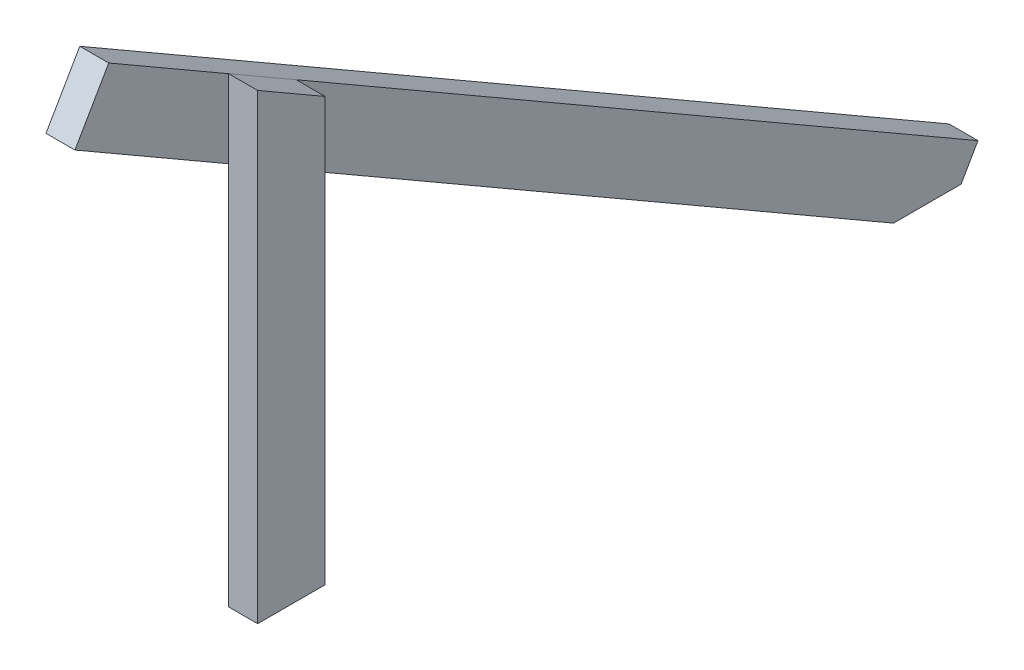
ISO-10303-21;
HEADER;
FILE_DESCRIPTION(('STEP AP214'),'2;1');
FILE_NAME('part.step','',(''),(''),'','','');
FILE_SCHEMA(('AUTOMOTIVE_DESIGN { 1 0 10303 214 1 1 1 1 }'));
ENDSEC;
DATA;
#1=APPLICATION_CONTEXT('core data for automotive mechanical design processes');
#2=APPLICATION_PROTOCOL_DEFINITION('international standard','automotive_design',2000,#1);
#3=PRODUCT_CONTEXT('',#1,'mechanical');
#4=PRODUCT('Part','Part','',(#3));
#5=PRODUCT_RELATED_PRODUCT_CATEGORY('part','',(#4));
#6=PRODUCT_DEFINITION_FORMATION('','',#4);
#7=PRODUCT_DEFINITION_CONTEXT('part definition',#1,'design');
#8=PRODUCT_DEFINITION('design','',#6,#7);
#9=PRODUCT_DEFINITION_SHAPE('','',#8);
#10=(LENGTH_UNIT() NAMED_UNIT(*) SI_UNIT(.MILLI.,.METRE.));
#11=(NAMED_UNIT(*) PLANE_ANGLE_UNIT() SI_UNIT($,.RADIAN.));
#12=(NAMED_UNIT(*) SI_UNIT($,.STERADIAN.) SOLID_ANGLE_UNIT());
#13=UNCERTAINTY_MEASURE_WITH_UNIT(LENGTH_MEASURE(1.E-05),#10,'distance_accuracy_value','');
#14=(GEOMETRIC_REPRESENTATION_CONTEXT(3) GLOBAL_UNCERTAINTY_ASSIGNED_CONTEXT((#13)) GLOBAL_UNIT_ASSIGNED_CONTEXT((#10,
#11,#12)) REPRESENTATION_CONTEXT('',''));
#15=CARTESIAN_POINT('',(0.,0.,0.));
#16=DIRECTION('',(0.,0.,1.));
#17=DIRECTION('',(1.,0.,0.));
#18=AXIS2_PLACEMENT_3D('',#15,#16,#17);
#19=CARTESIAN_POINT('',(57.1500000000016,2.22044604925031E-13,963.751224977093));
#20=DIRECTION('',(-1.,0.,0.));
#21=DIRECTION('',(0.,-1.,0.));
#22=AXIS2_PLACEMENT_3D('',#19,#20,#21);
#23=PLANE('',#22);
#24=DIRECTION('',(0.,-0.500000000000001,-0.866025403784438));
#25=VECTOR('',#24,1.);
#26=CARTESIAN_POINT('',(57.1500000000006,455.811351077486,700.588418732819));
#27=LINE('',#26,#25);
#28=CARTESIAN_POINT('',(57.1499999999997,607.748468103316,963.751224977093));
#29=VERTEX_POINT('',#28);
#30=CARTESIAN_POINT('',(57.15,556.422029172358,874.851224977093));
#31=VERTEX_POINT('',#30);
#32=EDGE_CURVE('E151',#29,#31,#27,.T.);
#33=ORIENTED_EDGE('',*,*,#32,.F.);
#34=DIRECTION('',(0.,1.,0.));
#35=VECTOR('',#34,1.);
#36=CARTESIAN_POINT('',(57.1500000000016,2.22044604925031E-13,963.751224977093));
#37=LINE('',#36,#35);
#38=CARTESIAN_POINT('',(57.1500000000016,2.22044604925031E-13,963.751224977093));
#39=VERTEX_POINT('',#38);
#40=EDGE_CURVE('E152',#39,#29,#37,.T.);
#41=ORIENTED_EDGE('',*,*,#40,.F.);
#42=DIRECTION('',(0.,0.,1.));
#43=VECTOR('',#42,1.);
#44=CARTESIAN_POINT('',(57.1500000000016,2.22044604925031E-13,963.751224977093));
#45=LINE('',#44,#43);
#46=CARTESIAN_POINT('',(57.1500000000017,3.33066907387547E-13,874.851224977093));
#47=VERTEX_POINT('',#46);
#48=EDGE_CURVE('E167',#47,#39,#45,.T.);
#49=ORIENTED_EDGE('',*,*,#48,.F.);
#50=DIRECTION('',(0.,1.,0.));
#51=VECTOR('',#50,1.);
#52=CARTESIAN_POINT('',(57.1500000000017,3.33066907387547E-13,874.851224977093));
#53=LINE('',#52,#51);
#54=EDGE_CURVE('E106',#47,#31,#53,.T.);
#55=ORIENTED_EDGE('',*,*,#54,.T.);
#56=EDGE_LOOP('',(#33,#41,#49,#55));
#57=FACE_BOUND('',#56,.T.);
#58=ADVANCED_FACE('F102',(#57),#23,.F.);
#59=CARTESIAN_POINT('',(19.0500000000016,1.11022302462516E-13,963.751224977093));
#60=DIRECTION('',(0.,0.,-1.));
#61=DIRECTION('',(0.,1.,0.));
#62=AXIS2_PLACEMENT_3D('',#59,#60,#61);
#63=PLANE('',#62);
#64=DIRECTION('',(1.,0.,0.));
#65=VECTOR('',#64,1.);
#66=CARTESIAN_POINT('',(19.0499999999992,607.748468103316,963.751224977093));
#67=LINE('',#66,#65);
#68=CARTESIAN_POINT('',(19.0499999999997,607.748468103315,963.751224977093));
#69=VERTEX_POINT('',#68);
#70=EDGE_CURVE('E140',#69,#29,#67,.T.);
#71=ORIENTED_EDGE('',*,*,#70,.F.);
#72=DIRECTION('',(0.,1.,0.));
#73=VECTOR('',#72,1.);
#74=CARTESIAN_POINT('',(19.0500000000016,1.11022302462516E-13,963.751224977093));
#75=LINE('',#74,#73);
#76=CARTESIAN_POINT('',(19.0500000000016,1.11022302462516E-13,963.751224977093));
#77=VERTEX_POINT('',#76);
#78=EDGE_CURVE('E157',#77,#69,#75,.T.);
#79=ORIENTED_EDGE('',*,*,#78,.F.);
#80=DIRECTION('',(-1.,0.,0.));
#81=VECTOR('',#80,1.);
#82=CARTESIAN_POINT('',(19.0500000000016,1.11022302462516E-13,963.751224977093));
#83=LINE('',#82,#81);
#84=EDGE_CURVE('E135',#39,#77,#83,.T.);
#85=ORIENTED_EDGE('',*,*,#84,.F.);
#86=ORIENTED_EDGE('',*,*,#40,.T.);
#87=EDGE_LOOP('',(#71,#79,#85,#86));
#88=FACE_BOUND('',#87,.T.);
#89=ADVANCED_FACE('F156',(#88),#63,.F.);
#90=CARTESIAN_POINT('',(19.0500000000016,1.11022302462516E-13,963.751224977093));
#91=DIRECTION('',(1.,0.,0.));
#92=DIRECTION('',(0.,1.,0.));
#93=AXIS2_PLACEMENT_3D('',#90,#91,#92);
#94=PLANE('',#93);
#95=DIRECTION('',(0.,0.500000000000001,0.866025403784438));
#96=VECTOR('',#95,1.);
#97=CARTESIAN_POINT('',(19.0500000000006,455.811351077486,700.588418732819));
#98=LINE('',#97,#96);
#99=CARTESIAN_POINT('',(19.0499999999917,556.422029172358,874.851224977093));
#100=VERTEX_POINT('',#99);
#101=EDGE_CURVE('E13',#100,#69,#98,.T.);
#102=ORIENTED_EDGE('',*,*,#101,.F.);
#103=DIRECTION('',(0.,1.,0.));
#104=VECTOR('',#103,1.);
#105=CARTESIAN_POINT('',(19.0500000000017,2.22044604925031E-13,874.851224977093));
#106=LINE('',#105,#104);
#107=CARTESIAN_POINT('',(19.0500000000017,2.22044604925031E-13,874.851224977093));
#108=VERTEX_POINT('',#107);
#109=EDGE_CURVE('E166',#108,#100,#106,.T.);
#110=ORIENTED_EDGE('',*,*,#109,.F.);
#111=DIRECTION('',(0.,0.,-1.));
#112=VECTOR('',#111,1.);
#113=CARTESIAN_POINT('',(19.0500000000016,1.11022302462516E-13,963.751224977093));
#114=LINE('',#113,#112);
#115=EDGE_CURVE('E161',#77,#108,#114,.T.);
#116=ORIENTED_EDGE('',*,*,#115,.F.);
#117=ORIENTED_EDGE('',*,*,#78,.T.);
#118=EDGE_LOOP('',(#102,#110,#116,#117));
#119=FACE_BOUND('',#118,.T.);
#120=ADVANCED_FACE('F175',(#119),#94,.F.);
#121=CARTESIAN_POINT('',(19.0500000000017,2.22044604925031E-13,874.851224977093));
#122=DIRECTION('',(0.,0.,1.));
#123=DIRECTION('',(0.,-1.,0.));
#124=AXIS2_PLACEMENT_3D('',#121,#122,#123);
#125=PLANE('',#124);
#126=DIRECTION('',(-1.,0.,0.));
#127=VECTOR('',#126,1.);
#128=CARTESIAN_POINT('',(19.0499999999995,556.422029172358,874.851224977093));
#129=LINE('',#128,#127);
#130=EDGE_CURVE('E112',#31,#100,#129,.T.);
#131=ORIENTED_EDGE('',*,*,#130,.F.);
#132=ORIENTED_EDGE('',*,*,#54,.F.);
#133=DIRECTION('',(1.,0.,0.));
#134=VECTOR('',#133,1.);
#135=CARTESIAN_POINT('',(19.0500000000017,2.22044604925031E-13,874.851224977093));
#136=LINE('',#135,#134);
#137=EDGE_CURVE('E121',#108,#47,#136,.T.);
#138=ORIENTED_EDGE('',*,*,#137,.F.);
#139=ORIENTED_EDGE('',*,*,#109,.T.);
#140=EDGE_LOOP('',(#131,#132,#138,#139));
#141=FACE_BOUND('',#140,.T.);
#142=ADVANCED_FACE('F176',(#141),#125,.F.);
#143=CARTESIAN_POINT('',(19.0500000000001,1.33226762955019E-12,5.5181307555685E-13));
#144=DIRECTION('',(0.,-1.,0.));
#145=DIRECTION('',(1.,0.,0.));
#146=AXIS2_PLACEMENT_3D('',#143,#144,#145);
#147=PLANE('',#146);
#148=ORIENTED_EDGE('',*,*,#48,.T.);
#149=ORIENTED_EDGE('',*,*,#84,.T.);
#150=ORIENTED_EDGE('',*,*,#115,.T.);
#151=ORIENTED_EDGE('',*,*,#137,.T.);
#152=EDGE_LOOP('',(#148,#149,#150,#151));
#153=FACE_BOUND('',#152,.T.);
#154=ADVANCED_FACE('F173',(#153),#147,.T.);
#155=CARTESIAN_POINT('',(-19.0500000000002,698.894829198219,1121.62135331849));
#156=DIRECTION('',(0.,0.866025403784438,-0.500000000000001));
#157=DIRECTION('',(0.,0.500000000000001,0.866025403784438));
#158=AXIS2_PLACEMENT_3D('',#155,#156,#157);
#159=PLANE('',#158);
#160=ORIENTED_EDGE('',*,*,#70,.T.);
#161=ORIENTED_EDGE('',*,*,#32,.T.);
#162=ORIENTED_EDGE('',*,*,#130,.T.);
#163=ORIENTED_EDGE('',*,*,#101,.T.);
#164=EDGE_LOOP('',(#160,#161,#162,#163));
#165=FACE_BOUND('',#164,.T.);
#166=ADVANCED_FACE('F104',(#165),#159,.T.);
#167=CLOSED_SHELL('',(#58,#89,#120,#142,#154,#166));
#168=MANIFOLD_SOLID_BREP('B2',#167);
#169=CARTESIAN_POINT('',(19.0499999999998,698.89482919822,1121.62135331849));
#170=DIRECTION('',(-1.,0.,0.));
#171=DIRECTION('',(0.,-1.,0.));
#172=AXIS2_PLACEMENT_3D('',#169,#170,#171);
#173=PLANE('',#172);
#174=DIRECTION('',(0.,-0.500000000000001,-0.866025403784438));
#175=VECTOR('',#174,1.);
#176=CARTESIAN_POINT('',(19.0500000000002,621.905170801783,1166.07135331849));
#177=LINE('',#176,#175);
#178=CARTESIAN_POINT('',(19.0500000000002,621.905170801783,1166.07135331849));
#179=VERTEX_POINT('',#178);
#180=CARTESIAN_POINT('',(19.0500000000002,1.11022302462513E-13,88.8999999999997));
#181=VERTEX_POINT('',#180);
#182=EDGE_CURVE('E328',#179,#181,#177,.T.);
#183=ORIENTED_EDGE('',*,*,#182,.T.);
#184=DIRECTION('',(0.,0.,-1.));
#185=VECTOR('',#184,1.);
#186=CARTESIAN_POINT('',(19.050000000002,1.11022302462516E-13,1121.62135331849));
#187=LINE('',#186,#185);
#188=CARTESIAN_POINT('',(19.0500000000002,0.,0.));
#189=VERTEX_POINT('',#188);
#190=EDGE_CURVE('E317',#181,#189,#187,.T.);
#191=ORIENTED_EDGE('',*,*,#190,.T.);
#192=DIRECTION('',(0.,0.866025403784438,-0.500000000000001));
#193=VECTOR('',#192,1.);
#194=CARTESIAN_POINT('',(19.0499999999998,38.4948291982183,-22.2250000000001));
#195=LINE('',#194,#193);
#196=CARTESIAN_POINT('',(19.0499999999998,38.4948291982183,-22.2250000000001));
#197=VERTEX_POINT('',#196);
#198=EDGE_CURVE('E326',#189,#197,#195,.T.);
#199=ORIENTED_EDGE('',*,*,#198,.T.);
#200=DIRECTION('',(0.,-0.500000000000001,-0.866025403784438));
#201=VECTOR('',#200,1.);
#202=CARTESIAN_POINT('',(19.0499999999998,698.89482919822,1121.62135331849));
#203=LINE('',#202,#201);
#204=CARTESIAN_POINT('',(19.0499999999998,698.89482919822,1121.62135331849));
#205=VERTEX_POINT('',#204);
#206=EDGE_CURVE('E272',#205,#197,#203,.T.);
#207=ORIENTED_EDGE('',*,*,#206,.F.);
#208=DIRECTION('',(0.,0.866025403784438,-0.500000000000001));
#209=VECTOR('',#208,1.);
#210=CARTESIAN_POINT('',(19.0499999999998,698.89482919822,1121.62135331849));
#211=LINE('',#210,#209);
#212=EDGE_CURVE('E340',#179,#205,#211,.T.);
#213=ORIENTED_EDGE('',*,*,#212,.F.);
#214=EDGE_LOOP('',(#183,#191,#199,#207,#213));
#215=FACE_BOUND('',#214,.T.);
#216=ADVANCED_FACE('F265',(#215),#173,.F.);
#217=CARTESIAN_POINT('',(-19.0500000000002,698.894829198219,1121.62135331849));
#218=DIRECTION('',(0.,-0.866025403784438,0.500000000000001));
#219=DIRECTION('',(0.,-0.500000000000001,-0.866025403784438));
#220=AXIS2_PLACEMENT_3D('',#217,#218,#219);
#221=PLANE('',#220);
#222=DIRECTION('',(-1.,0.,0.));
#223=VECTOR('',#222,1.);
#224=CARTESIAN_POINT('',(-19.0500000000002,38.4948291982182,-22.225));
#225=LINE('',#224,#223);
#226=CARTESIAN_POINT('',(-19.0500000000002,38.4948291982182,-22.225));
#227=VERTEX_POINT('',#226);
#228=EDGE_CURVE('E303',#197,#227,#225,.T.);
#229=ORIENTED_EDGE('',*,*,#228,.T.);
#230=DIRECTION('',(0.,-0.500000000000001,-0.866025403784438));
#231=VECTOR('',#230,1.);
#232=CARTESIAN_POINT('',(-19.0500000000002,698.894829198219,1121.62135331849));
#233=LINE('',#232,#231);
#234=CARTESIAN_POINT('',(-19.0500000000002,698.894829198219,1121.62135331849));
#235=VERTEX_POINT('',#234);
#236=EDGE_CURVE('E345',#235,#227,#233,.T.);
#237=ORIENTED_EDGE('',*,*,#236,.F.);
#238=DIRECTION('',(-1.,0.,0.));
#239=VECTOR('',#238,1.);
#240=CARTESIAN_POINT('',(-19.0500000000002,698.894829198219,1121.62135331849));
#241=LINE('',#240,#239);
#242=EDGE_CURVE('E308',#205,#235,#241,.T.);
#243=ORIENTED_EDGE('',*,*,#242,.F.);
#244=ORIENTED_EDGE('',*,*,#206,.T.);
#245=EDGE_LOOP('',(#229,#237,#243,#244));
#246=FACE_BOUND('',#245,.T.);
#247=ADVANCED_FACE('F346',(#246),#221,.F.);
#248=CARTESIAN_POINT('',(-19.0500000000002,698.894829198219,1121.62135331849));
#249=DIRECTION('',(1.,0.,0.));
#250=DIRECTION('',(0.,1.,0.));
#251=AXIS2_PLACEMENT_3D('',#248,#249,#250);
#252=PLANE('',#251);
#253=DIRECTION('',(0.,-0.866025403784438,0.500000000000001));
#254=VECTOR('',#253,1.);
#255=CARTESIAN_POINT('',(-19.0500000000002,38.4948291982182,-22.225));
#256=LINE('',#255,#254);
#257=CARTESIAN_POINT('',(-19.05,0.,0.));
#258=VERTEX_POINT('',#257);
#259=EDGE_CURVE('E333',#227,#258,#256,.T.);
#260=ORIENTED_EDGE('',*,*,#259,.T.);
#261=DIRECTION('',(0.,0.,1.));
#262=VECTOR('',#261,1.);
#263=CARTESIAN_POINT('',(-19.049999999998,0.,1121.62135331849));
#264=LINE('',#263,#262);
#265=CARTESIAN_POINT('',(-19.0499999999998,0.,88.9));
#266=VERTEX_POINT('',#265);
#267=EDGE_CURVE('E279',#258,#266,#264,.T.);
#268=ORIENTED_EDGE('',*,*,#267,.T.);
#269=DIRECTION('',(0.,-0.500000000000001,-0.866025403784438));
#270=VECTOR('',#269,1.);
#271=CARTESIAN_POINT('',(-19.0499999999998,621.905170801783,1166.07135331849));
#272=LINE('',#271,#270);
#273=CARTESIAN_POINT('',(-19.0499999999998,621.905170801783,1166.07135331849));
#274=VERTEX_POINT('',#273);
#275=EDGE_CURVE('E342',#274,#266,#272,.T.);
#276=ORIENTED_EDGE('',*,*,#275,.F.);
#277=DIRECTION('',(0.,-0.866025403784438,0.500000000000001));
#278=VECTOR('',#277,1.);
#279=CARTESIAN_POINT('',(-19.0500000000002,698.894829198219,1121.62135331849));
#280=LINE('',#279,#278);
#281=EDGE_CURVE('E348',#235,#274,#280,.T.);
#282=ORIENTED_EDGE('',*,*,#281,.F.);
#283=ORIENTED_EDGE('',*,*,#236,.T.);
#284=EDGE_LOOP('',(#260,#268,#276,#282,#283));
#285=FACE_BOUND('',#284,.T.);
#286=ADVANCED_FACE('F354',(#285),#252,.F.);
#287=CARTESIAN_POINT('',(-19.0499999999998,621.905170801783,1166.07135331849));
#288=DIRECTION('',(0.,0.866025403784438,-0.500000000000001));
#289=DIRECTION('',(0.,0.500000000000001,0.866025403784438));
#290=AXIS2_PLACEMENT_3D('',#287,#288,#289);
#291=PLANE('',#290);
#292=ORIENTED_EDGE('',*,*,#275,.T.);
#293=DIRECTION('',(1.,0.,0.));
#294=VECTOR('',#293,1.);
#295=CARTESIAN_POINT('',(-19.0499999999995,0.,88.9));
#296=LINE('',#295,#294);
#297=EDGE_CURVE('E329',#266,#181,#296,.T.);
#298=ORIENTED_EDGE('',*,*,#297,.T.);
#299=ORIENTED_EDGE('',*,*,#182,.F.);
#300=DIRECTION('',(1.,0.,0.));
#301=VECTOR('',#300,1.);
#302=CARTESIAN_POINT('',(-19.0499999999998,621.905170801783,1166.07135331849));
#303=LINE('',#302,#301);
#304=EDGE_CURVE('E287',#274,#179,#303,.T.);
#305=ORIENTED_EDGE('',*,*,#304,.F.);
#306=EDGE_LOOP('',(#292,#298,#299,#305));
#307=FACE_BOUND('',#306,.T.);
#308=ADVANCED_FACE('F356',(#307),#291,.F.);
#309=CARTESIAN_POINT('',(0.,660.400000000001,1143.84635331849));
#310=DIRECTION('',(0.,0.500000000000001,0.866025403784438));
#311=DIRECTION('',(0.,-0.866025403784438,0.500000000000001));
#312=AXIS2_PLACEMENT_3D('',#309,#310,#311);
#313=PLANE('',#312);
#314=ORIENTED_EDGE('',*,*,#212,.T.);
#315=ORIENTED_EDGE('',*,*,#242,.T.);
#316=ORIENTED_EDGE('',*,*,#281,.T.);
#317=ORIENTED_EDGE('',*,*,#304,.T.);
#318=EDGE_LOOP('',(#314,#315,#316,#317));
#319=FACE_BOUND('',#318,.T.);
#320=ADVANCED_FACE('F352',(#319),#313,.T.);
#321=CARTESIAN_POINT('',(0.,0.,0.));
#322=DIRECTION('',(0.,0.500000000000001,0.866025403784438));
#323=DIRECTION('',(0.,-0.866025403784438,0.500000000000001));
#324=AXIS2_PLACEMENT_3D('',#321,#322,#323);
#325=PLANE('',#324);
#326=ORIENTED_EDGE('',*,*,#198,.F.);
#327=DIRECTION('',(-1.,0.,0.));
#328=VECTOR('',#327,1.);
#329=CARTESIAN_POINT('',(0.,0.,0.));
#330=LINE('',#329,#328);
#331=EDGE_CURVE('E100',#189,#258,#330,.T.);
#332=ORIENTED_EDGE('',*,*,#331,.T.);
#333=ORIENTED_EDGE('',*,*,#259,.F.);
#334=ORIENTED_EDGE('',*,*,#228,.F.);
#335=EDGE_LOOP('',(#326,#332,#333,#334));
#336=FACE_BOUND('',#335,.T.);
#337=ADVANCED_FACE('F331',(#336),#325,.F.);
#338=CARTESIAN_POINT('',(1817.38832409287,5.65099187849368E-12,764.986915908719));
#339=DIRECTION('',(0.,1.,0.));
#340=DIRECTION('',(-1.,0.,0.));
#341=AXIS2_PLACEMENT_3D('',#338,#339,#340);
#342=PLANE('',#341);
#343=ORIENTED_EDGE('',*,*,#297,.F.);
#344=ORIENTED_EDGE('',*,*,#267,.F.);
#345=ORIENTED_EDGE('',*,*,#331,.F.);
#346=ORIENTED_EDGE('',*,*,#190,.F.);
#347=EDGE_LOOP('',(#343,#344,#345,#346));
#348=FACE_BOUND('',#347,.T.);
#349=ADVANCED_FACE('F316',(#348),#342,.F.);
#350=CLOSED_SHELL('',(#216,#247,#286,#308,#320,#337,#349));
#351=MANIFOLD_SOLID_BREP('B7',#350);
#352=ADVANCED_BREP_SHAPE_REPRESENTATION('',(#18,#168,#351),#14);
#353=SHAPE_DEFINITION_REPRESENTATION(#9,#352);
ENDSEC;
END-ISO-10303-21;
